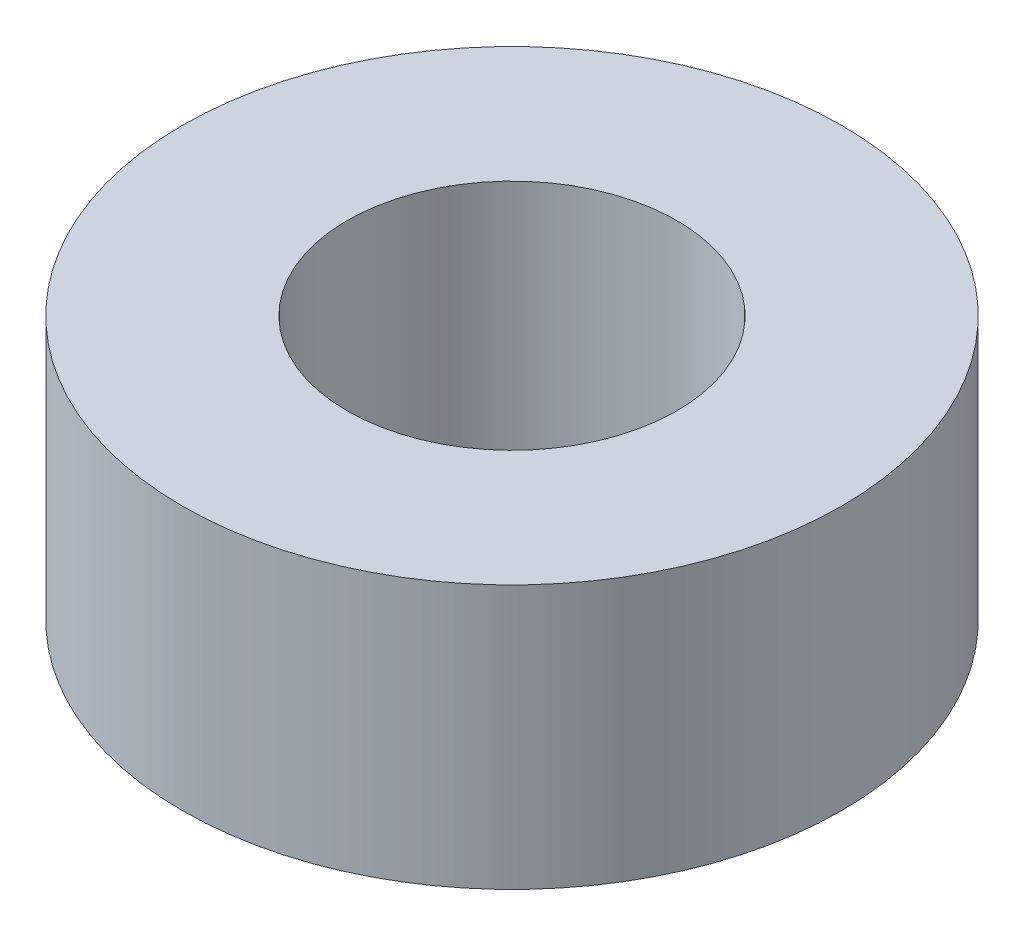
ISO-10303-21;
HEADER;
FILE_DESCRIPTION(('STEP AP214'),'2;1');
FILE_NAME('part.step','',(''),(''),'','','');
FILE_SCHEMA(('AUTOMOTIVE_DESIGN { 1 0 10303 214 1 1 1 1 }'));
ENDSEC;
DATA;
#1=APPLICATION_CONTEXT('core data for automotive mechanical design processes');
#2=APPLICATION_PROTOCOL_DEFINITION('international standard','automotive_design',2000,#1);
#3=PRODUCT_CONTEXT('',#1,'mechanical');
#4=PRODUCT('Part','Part','',(#3));
#5=PRODUCT_RELATED_PRODUCT_CATEGORY('part','',(#4));
#6=PRODUCT_DEFINITION_FORMATION('','',#4);
#7=PRODUCT_DEFINITION_CONTEXT('part definition',#1,'design');
#8=PRODUCT_DEFINITION('design','',#6,#7);
#9=PRODUCT_DEFINITION_SHAPE('','',#8);
#10=(LENGTH_UNIT() NAMED_UNIT(*) SI_UNIT(.MILLI.,.METRE.));
#11=(NAMED_UNIT(*) PLANE_ANGLE_UNIT() SI_UNIT($,.RADIAN.));
#12=(NAMED_UNIT(*) SI_UNIT($,.STERADIAN.) SOLID_ANGLE_UNIT());
#13=UNCERTAINTY_MEASURE_WITH_UNIT(LENGTH_MEASURE(1.E-05),#10,'distance_accuracy_value','');
#14=(GEOMETRIC_REPRESENTATION_CONTEXT(3) GLOBAL_UNCERTAINTY_ASSIGNED_CONTEXT((#13)) GLOBAL_UNIT_ASSIGNED_CONTEXT((#10,
#11,#12)) REPRESENTATION_CONTEXT('',''));
#15=CARTESIAN_POINT('',(0.,0.,0.));
#16=DIRECTION('',(0.,0.,1.));
#17=DIRECTION('',(1.,0.,0.));
#18=AXIS2_PLACEMENT_3D('',#15,#16,#17);
#19=CARTESIAN_POINT('',(0.,4.,0.));
#20=DIRECTION('',(0.,1.,0.));
#21=DIRECTION('',(0.,0.,1.));
#22=AXIS2_PLACEMENT_3D('',#19,#20,#21);
#23=PLANE('',#22);
#24=CARTESIAN_POINT('',(0.,4.,0.));
#25=DIRECTION('',(0.,1.,0.));
#26=DIRECTION('',(0.,0.,1.));
#27=AXIS2_PLACEMENT_3D('',#24,#25,#26);
#28=CIRCLE('',#27,5.);
#29=CARTESIAN_POINT('',(0.,4.,5.));
#30=VERTEX_POINT('',#29);
#31=EDGE_CURVE('E10',#30,#30,#28,.T.);
#32=ORIENTED_EDGE('',*,*,#31,.T.);
#33=EDGE_LOOP('',(#32));
#34=FACE_BOUND('',#33,.T.);
#35=CARTESIAN_POINT('',(0.,4.,0.));
#36=DIRECTION('',(0.,1.,0.));
#37=DIRECTION('',(0.,0.,1.));
#38=AXIS2_PLACEMENT_3D('',#35,#36,#37);
#39=CIRCLE('',#38,2.5);
#40=CARTESIAN_POINT('',(0.,4.,2.5));
#41=VERTEX_POINT('',#40);
#42=EDGE_CURVE('E45',#41,#41,#39,.T.);
#43=ORIENTED_EDGE('',*,*,#42,.F.);
#44=EDGE_LOOP('',(#43));
#45=FACE_BOUND('',#44,.T.);
#46=ADVANCED_FACE('F34',(#34,#45),#23,.T.);
#47=CARTESIAN_POINT('',(0.,0.,0.));
#48=DIRECTION('',(0.,1.,0.));
#49=DIRECTION('',(0.,0.,1.));
#50=AXIS2_PLACEMENT_3D('',#47,#48,#49);
#51=PLANE('',#50);
#52=CARTESIAN_POINT('',(0.,0.,0.));
#53=DIRECTION('',(0.,1.,0.));
#54=DIRECTION('',(0.,0.,1.));
#55=AXIS2_PLACEMENT_3D('',#52,#53,#54);
#56=CIRCLE('',#55,5.);
#57=CARTESIAN_POINT('',(0.,0.,5.));
#58=VERTEX_POINT('',#57);
#59=EDGE_CURVE('E38',#58,#58,#56,.T.);
#60=ORIENTED_EDGE('',*,*,#59,.F.);
#61=EDGE_LOOP('',(#60));
#62=FACE_BOUND('',#61,.T.);
#63=CARTESIAN_POINT('',(0.,0.,0.));
#64=DIRECTION('',(0.,1.,0.));
#65=DIRECTION('',(0.,0.,1.));
#66=AXIS2_PLACEMENT_3D('',#63,#64,#65);
#67=CIRCLE('',#66,2.5);
#68=CARTESIAN_POINT('',(0.,0.,2.5));
#69=VERTEX_POINT('',#68);
#70=EDGE_CURVE('E47',#69,#69,#67,.T.);
#71=ORIENTED_EDGE('',*,*,#70,.T.);
#72=EDGE_LOOP('',(#71));
#73=FACE_BOUND('',#72,.T.);
#74=ADVANCED_FACE('F57',(#62,#73),#51,.F.);
#75=CARTESIAN_POINT('',(0.,4.,0.));
#76=DIRECTION('',(0.,-1.,0.));
#77=DIRECTION('',(0.,0.,-1.));
#78=AXIS2_PLACEMENT_3D('',#75,#76,#77);
#79=CYLINDRICAL_SURFACE('',#78,5.);
#80=ORIENTED_EDGE('',*,*,#31,.F.);
#81=EDGE_LOOP('',(#80));
#82=FACE_BOUND('',#81,.T.);
#83=ORIENTED_EDGE('',*,*,#59,.T.);
#84=EDGE_LOOP('',(#83));
#85=FACE_BOUND('',#84,.T.);
#86=ADVANCED_FACE('F36',(#82,#85),#79,.T.);
#87=CARTESIAN_POINT('',(0.,4.,0.));
#88=DIRECTION('',(0.,-1.,0.));
#89=DIRECTION('',(0.,0.,-1.));
#90=AXIS2_PLACEMENT_3D('',#87,#88,#89);
#91=CYLINDRICAL_SURFACE('',#90,2.5);
#92=ORIENTED_EDGE('',*,*,#42,.T.);
#93=EDGE_LOOP('',(#92));
#94=FACE_BOUND('',#93,.T.);
#95=ORIENTED_EDGE('',*,*,#70,.F.);
#96=EDGE_LOOP('',(#95));
#97=FACE_BOUND('',#96,.T.);
#98=ADVANCED_FACE('F53',(#94,#97),#91,.F.);
#99=CLOSED_SHELL('',(#46,#74,#86,#98));
#100=MANIFOLD_SOLID_BREP('B2',#99);
#101=ADVANCED_BREP_SHAPE_REPRESENTATION('',(#18,#100),#14);
#102=SHAPE_DEFINITION_REPRESENTATION(#9,#101);
ENDSEC;
END-ISO-10303-21;
